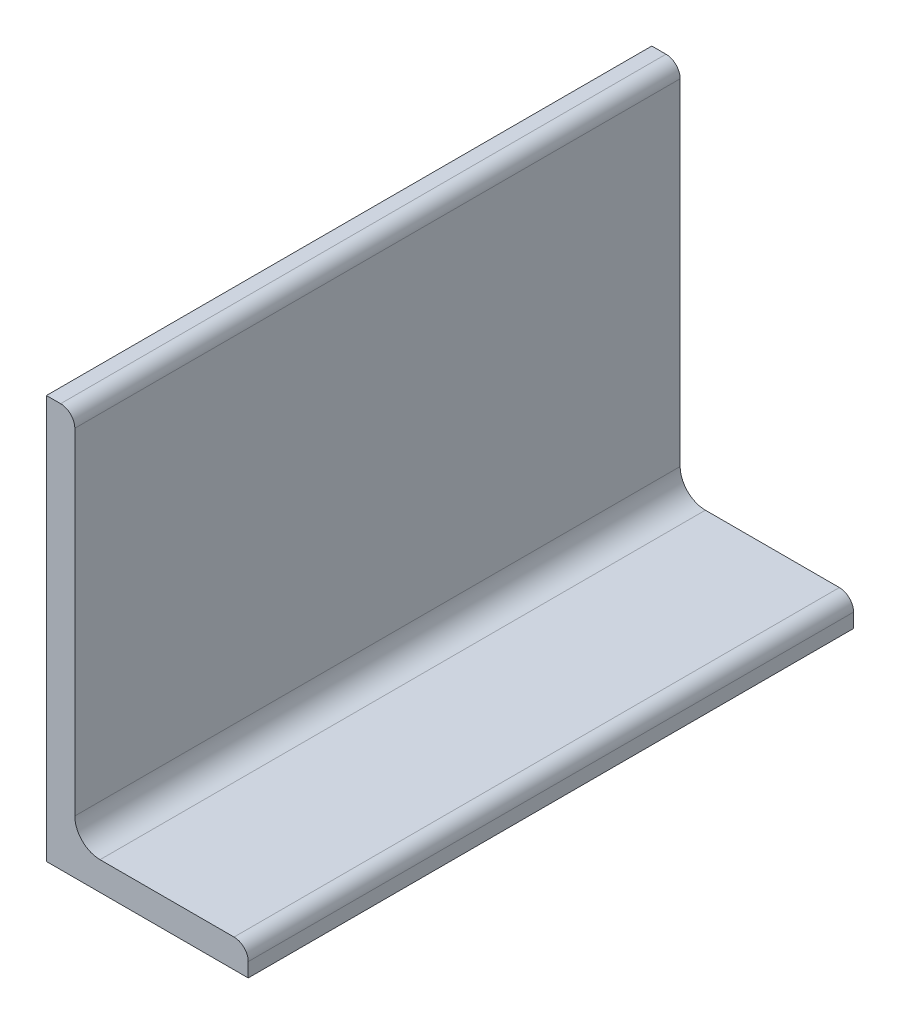
ISO-10303-21;
HEADER;
FILE_DESCRIPTION(('STEP AP214'),'2;1');
FILE_NAME('part.step','',(''),(''),'','','');
FILE_SCHEMA(('AUTOMOTIVE_DESIGN { 1 0 10303 214 1 1 1 1 }'));
ENDSEC;
DATA;
#1=APPLICATION_CONTEXT('core data for automotive mechanical design processes');
#2=APPLICATION_PROTOCOL_DEFINITION('international standard','automotive_design',2000,#1);
#3=PRODUCT_CONTEXT('',#1,'mechanical');
#4=PRODUCT('Part','Part','',(#3));
#5=PRODUCT_RELATED_PRODUCT_CATEGORY('part','',(#4));
#6=PRODUCT_DEFINITION_FORMATION('','',#4);
#7=PRODUCT_DEFINITION_CONTEXT('part definition',#1,'design');
#8=PRODUCT_DEFINITION('design','',#6,#7);
#9=PRODUCT_DEFINITION_SHAPE('','',#8);
#10=(LENGTH_UNIT() NAMED_UNIT(*) SI_UNIT(.MILLI.,.METRE.));
#11=(NAMED_UNIT(*) PLANE_ANGLE_UNIT() SI_UNIT($,.RADIAN.));
#12=(NAMED_UNIT(*) SI_UNIT($,.STERADIAN.) SOLID_ANGLE_UNIT());
#13=UNCERTAINTY_MEASURE_WITH_UNIT(LENGTH_MEASURE(1.E-05),#10,'distance_accuracy_value','');
#14=(GEOMETRIC_REPRESENTATION_CONTEXT(3) GLOBAL_UNCERTAINTY_ASSIGNED_CONTEXT((#13)) GLOBAL_UNIT_ASSIGNED_CONTEXT((#10,
#11,#12)) REPRESENTATION_CONTEXT('',''));
#15=CARTESIAN_POINT('',(0.,0.,0.));
#16=DIRECTION('',(0.,0.,1.));
#17=DIRECTION('',(1.,0.,0.));
#18=AXIS2_PLACEMENT_3D('',#15,#16,#17);
#19=CARTESIAN_POINT('',(0.865045893659089,203.678837479771,304.8));
#20=DIRECTION('',(1.,0.,0.));
#21=DIRECTION('',(0.,0.,-1.));
#22=AXIS2_PLACEMENT_3D('',#19,#20,#21);
#23=PLANE('',#22);
#24=DIRECTION('',(0.,-1.,0.));
#25=VECTOR('',#24,1.);
#26=CARTESIAN_POINT('',(0.865045893659089,203.678837479771,0.));
#27=LINE('',#26,#25);
#28=CARTESIAN_POINT('',(0.865045893659089,203.678837479771,0.));
#29=VERTEX_POINT('',#28);
#30=CARTESIAN_POINT('',(0.865045893659089,0.478837479771347,0.));
#31=VERTEX_POINT('',#30);
#32=EDGE_CURVE('E135',#29,#31,#27,.T.);
#33=ORIENTED_EDGE('',*,*,#32,.T.);
#34=DIRECTION('',(0.,0.,-1.));
#35=VECTOR('',#34,1.);
#36=CARTESIAN_POINT('',(0.865045893659089,0.478837479771347,304.8));
#37=LINE('',#36,#35);
#38=CARTESIAN_POINT('',(0.865045893659089,0.478837479771347,304.8));
#39=VERTEX_POINT('',#38);
#40=EDGE_CURVE('E11',#39,#31,#37,.T.);
#41=ORIENTED_EDGE('',*,*,#40,.F.);
#42=DIRECTION('',(0.,-1.,0.));
#43=VECTOR('',#42,1.);
#44=CARTESIAN_POINT('',(0.865045893659089,203.678837479771,304.8));
#45=LINE('',#44,#43);
#46=CARTESIAN_POINT('',(0.865045893659089,203.678837479771,304.8));
#47=VERTEX_POINT('',#46);
#48=EDGE_CURVE('E151',#47,#39,#45,.T.);
#49=ORIENTED_EDGE('',*,*,#48,.F.);
#50=DIRECTION('',(0.,0.,-1.));
#51=VECTOR('',#50,1.);
#52=CARTESIAN_POINT('',(0.865045893659089,203.678837479771,304.8));
#53=LINE('',#52,#51);
#54=EDGE_CURVE('E131',#47,#29,#53,.T.);
#55=ORIENTED_EDGE('',*,*,#54,.T.);
#56=EDGE_LOOP('',(#33,#41,#49,#55));
#57=FACE_BOUND('',#56,.T.);
#58=ADVANCED_FACE('F33',(#57),#23,.F.);
#59=CARTESIAN_POINT('',(0.865045893659089,0.478837479771347,304.8));
#60=DIRECTION('',(0.,1.,0.));
#61=DIRECTION('',(0.,0.,1.));
#62=AXIS2_PLACEMENT_3D('',#59,#60,#61);
#63=PLANE('',#62);
#64=DIRECTION('',(1.,0.,0.));
#65=VECTOR('',#64,1.);
#66=CARTESIAN_POINT('',(0.865045893659089,0.478837479771347,0.));
#67=LINE('',#66,#65);
#68=CARTESIAN_POINT('',(102.465045893659,0.478837479771347,0.));
#69=VERTEX_POINT('',#68);
#70=EDGE_CURVE('E138',#31,#69,#67,.T.);
#71=ORIENTED_EDGE('',*,*,#70,.T.);
#72=DIRECTION('',(0.,0.,-1.));
#73=VECTOR('',#72,1.);
#74=CARTESIAN_POINT('',(102.465045893659,0.478837479771347,304.8));
#75=LINE('',#74,#73);
#76=CARTESIAN_POINT('',(102.465045893659,0.478837479771347,304.8));
#77=VERTEX_POINT('',#76);
#78=EDGE_CURVE('E41',#77,#69,#75,.T.);
#79=ORIENTED_EDGE('',*,*,#78,.F.);
#80=DIRECTION('',(1.,0.,0.));
#81=VECTOR('',#80,1.);
#82=CARTESIAN_POINT('',(0.865045893659089,0.478837479771347,304.8));
#83=LINE('',#82,#81);
#84=EDGE_CURVE('E95',#39,#77,#83,.T.);
#85=ORIENTED_EDGE('',*,*,#84,.F.);
#86=ORIENTED_EDGE('',*,*,#40,.T.);
#87=EDGE_LOOP('',(#71,#79,#85,#86));
#88=FACE_BOUND('',#87,.T.);
#89=ADVANCED_FACE('F194',(#88),#63,.F.);
#90=CARTESIAN_POINT('',(102.465045893659,0.478837479771347,304.8));
#91=DIRECTION('',(-1.,0.,0.));
#92=DIRECTION('',(0.,0.,1.));
#93=AXIS2_PLACEMENT_3D('',#90,#91,#92);
#94=PLANE('',#93);
#95=DIRECTION('',(0.,1.,0.));
#96=VECTOR('',#95,1.);
#97=CARTESIAN_POINT('',(102.465045893659,0.478837479771347,0.));
#98=LINE('',#97,#96);
#99=CARTESIAN_POINT('',(102.465045893659,7.62258747977135,0.));
#100=VERTEX_POINT('',#99);
#101=EDGE_CURVE('E140',#69,#100,#98,.T.);
#102=ORIENTED_EDGE('',*,*,#101,.T.);
#103=DIRECTION('',(0.,0.,-1.));
#104=VECTOR('',#103,1.);
#105=CARTESIAN_POINT('',(102.465045893659,7.62258747977135,304.8));
#106=LINE('',#105,#104);
#107=CARTESIAN_POINT('',(102.465045893659,7.62258747977135,304.8));
#108=VERTEX_POINT('',#107);
#109=EDGE_CURVE('E161',#108,#100,#106,.T.);
#110=ORIENTED_EDGE('',*,*,#109,.F.);
#111=DIRECTION('',(0.,1.,0.));
#112=VECTOR('',#111,1.);
#113=CARTESIAN_POINT('',(102.465045893659,0.478837479771347,304.8));
#114=LINE('',#113,#112);
#115=EDGE_CURVE('E169',#77,#108,#114,.T.);
#116=ORIENTED_EDGE('',*,*,#115,.F.);
#117=ORIENTED_EDGE('',*,*,#78,.T.);
#118=EDGE_LOOP('',(#102,#110,#116,#117));
#119=FACE_BOUND('',#118,.T.);
#120=ADVANCED_FACE('F167',(#119),#94,.F.);
#121=CARTESIAN_POINT('',(95.3212958936591,7.62258747977135,304.8));
#122=DIRECTION('',(0.,0.,-1.));
#123=DIRECTION('',(-1.,0.,0.));
#124=AXIS2_PLACEMENT_3D('',#121,#122,#123);
#125=CYLINDRICAL_SURFACE('',#124,7.14375000000001);
#126=CARTESIAN_POINT('',(95.3212958936591,7.62258747977135,0.));
#127=DIRECTION('',(0.,0.,1.));
#128=DIRECTION('',(1.,0.,0.));
#129=AXIS2_PLACEMENT_3D('',#126,#127,#128);
#130=CIRCLE('',#129,7.14375000000001);
#131=CARTESIAN_POINT('',(95.3212958936591,14.7663374797714,0.));
#132=VERTEX_POINT('',#131);
#133=EDGE_CURVE('E142',#100,#132,#130,.T.);
#134=ORIENTED_EDGE('',*,*,#133,.T.);
#135=DIRECTION('',(0.,0.,-1.));
#136=VECTOR('',#135,1.);
#137=CARTESIAN_POINT('',(95.3212958936591,14.7663374797714,304.8));
#138=LINE('',#137,#136);
#139=CARTESIAN_POINT('',(95.3212958936591,14.7663374797714,304.8));
#140=VERTEX_POINT('',#139);
#141=EDGE_CURVE('E158',#140,#132,#138,.T.);
#142=ORIENTED_EDGE('',*,*,#141,.F.);
#143=CARTESIAN_POINT('',(95.3212958936591,7.62258747977135,304.8));
#144=DIRECTION('',(0.,0.,1.));
#145=DIRECTION('',(1.,0.,0.));
#146=AXIS2_PLACEMENT_3D('',#143,#144,#145);
#147=CIRCLE('',#146,7.14375000000001);
#148=EDGE_CURVE('E185',#108,#140,#147,.T.);
#149=ORIENTED_EDGE('',*,*,#148,.F.);
#150=ORIENTED_EDGE('',*,*,#109,.T.);
#151=EDGE_LOOP('',(#134,#142,#149,#150));
#152=FACE_BOUND('',#151,.T.);
#153=ADVANCED_FACE('F178',(#152),#125,.T.);
#154=CARTESIAN_POINT('',(95.3212958936591,14.7663374797713,304.8));
#155=DIRECTION('',(0.,-1.,0.));
#156=DIRECTION('',(0.,0.,-1.));
#157=AXIS2_PLACEMENT_3D('',#154,#155,#156);
#158=PLANE('',#157);
#159=DIRECTION('',(-1.,0.,0.));
#160=VECTOR('',#159,1.);
#161=CARTESIAN_POINT('',(95.3212958936591,14.7663374797713,0.));
#162=LINE('',#161,#160);
#163=CARTESIAN_POINT('',(27.8525458936591,14.7663374797713,0.));
#164=VERTEX_POINT('',#163);
#165=EDGE_CURVE('E144',#132,#164,#162,.T.);
#166=ORIENTED_EDGE('',*,*,#165,.T.);
#167=DIRECTION('',(0.,0.,-1.));
#168=VECTOR('',#167,1.);
#169=CARTESIAN_POINT('',(27.8525458936591,14.7663374797713,304.8));
#170=LINE('',#169,#168);
#171=CARTESIAN_POINT('',(27.8525458936591,14.7663374797713,304.8));
#172=VERTEX_POINT('',#171);
#173=EDGE_CURVE('E155',#172,#164,#170,.T.);
#174=ORIENTED_EDGE('',*,*,#173,.F.);
#175=DIRECTION('',(-1.,0.,0.));
#176=VECTOR('',#175,1.);
#177=CARTESIAN_POINT('',(95.3212958936591,14.7663374797713,304.8));
#178=LINE('',#177,#176);
#179=EDGE_CURVE('E184',#140,#172,#178,.T.);
#180=ORIENTED_EDGE('',*,*,#179,.F.);
#181=ORIENTED_EDGE('',*,*,#141,.T.);
#182=EDGE_LOOP('',(#166,#174,#180,#181));
#183=FACE_BOUND('',#182,.T.);
#184=ADVANCED_FACE('F182',(#183),#158,.F.);
#185=CARTESIAN_POINT('',(27.8525458936591,27.4663374797713,304.8));
#186=DIRECTION('',(0.,0.,-1.));
#187=DIRECTION('',(-1.,0.,0.));
#188=AXIS2_PLACEMENT_3D('',#185,#186,#187);
#189=CYLINDRICAL_SURFACE('',#188,12.7);
#190=CARTESIAN_POINT('',(27.8525458936591,27.4663374797713,0.));
#191=DIRECTION('',(0.,0.,-1.));
#192=DIRECTION('',(1.,0.,0.));
#193=AXIS2_PLACEMENT_3D('',#190,#191,#192);
#194=CIRCLE('',#193,12.7);
#195=CARTESIAN_POINT('',(15.1525458936591,27.4663374797713,0.));
#196=VERTEX_POINT('',#195);
#197=EDGE_CURVE('E146',#164,#196,#194,.T.);
#198=ORIENTED_EDGE('',*,*,#197,.T.);
#199=DIRECTION('',(0.,0.,-1.));
#200=VECTOR('',#199,1.);
#201=CARTESIAN_POINT('',(15.1525458936591,27.4663374797713,304.8));
#202=LINE('',#201,#200);
#203=CARTESIAN_POINT('',(15.1525458936591,27.4663374797713,304.8));
#204=VERTEX_POINT('',#203);
#205=EDGE_CURVE('E126',#204,#196,#202,.T.);
#206=ORIENTED_EDGE('',*,*,#205,.F.);
#207=CARTESIAN_POINT('',(27.8525458936591,27.4663374797713,304.8));
#208=DIRECTION('',(0.,0.,-1.));
#209=DIRECTION('',(1.,0.,0.));
#210=AXIS2_PLACEMENT_3D('',#207,#208,#209);
#211=CIRCLE('',#210,12.7);
#212=EDGE_CURVE('E117',#172,#204,#211,.T.);
#213=ORIENTED_EDGE('',*,*,#212,.F.);
#214=ORIENTED_EDGE('',*,*,#173,.T.);
#215=EDGE_LOOP('',(#198,#206,#213,#214));
#216=FACE_BOUND('',#215,.T.);
#217=ADVANCED_FACE('F206',(#216),#189,.F.);
#218=CARTESIAN_POINT('',(15.1525458936591,27.4663374797713,304.8));
#219=DIRECTION('',(-1.,0.,0.));
#220=DIRECTION('',(0.,0.,1.));
#221=AXIS2_PLACEMENT_3D('',#218,#219,#220);
#222=PLANE('',#221);
#223=DIRECTION('',(0.,1.,0.));
#224=VECTOR('',#223,1.);
#225=CARTESIAN_POINT('',(15.1525458936591,27.4663374797713,0.));
#226=LINE('',#225,#224);
#227=CARTESIAN_POINT('',(15.1525458936591,196.535087479771,0.));
#228=VERTEX_POINT('',#227);
#229=EDGE_CURVE('E125',#196,#228,#226,.T.);
#230=ORIENTED_EDGE('',*,*,#229,.T.);
#231=DIRECTION('',(0.,0.,-1.));
#232=VECTOR('',#231,1.);
#233=CARTESIAN_POINT('',(15.1525458936591,196.535087479771,304.8));
#234=LINE('',#233,#232);
#235=CARTESIAN_POINT('',(15.1525458936591,196.535087479771,304.8));
#236=VERTEX_POINT('',#235);
#237=EDGE_CURVE('E122',#236,#228,#234,.T.);
#238=ORIENTED_EDGE('',*,*,#237,.F.);
#239=DIRECTION('',(0.,1.,0.));
#240=VECTOR('',#239,1.);
#241=CARTESIAN_POINT('',(15.1525458936591,27.4663374797713,304.8));
#242=LINE('',#241,#240);
#243=EDGE_CURVE('E111',#204,#236,#242,.T.);
#244=ORIENTED_EDGE('',*,*,#243,.F.);
#245=ORIENTED_EDGE('',*,*,#205,.T.);
#246=EDGE_LOOP('',(#230,#238,#244,#245));
#247=FACE_BOUND('',#246,.T.);
#248=ADVANCED_FACE('F123',(#247),#222,.F.);
#249=CARTESIAN_POINT('',(8.00879589365907,196.535087479771,304.8));
#250=DIRECTION('',(0.,0.,-1.));
#251=DIRECTION('',(-1.,0.,0.));
#252=AXIS2_PLACEMENT_3D('',#249,#250,#251);
#253=CYLINDRICAL_SURFACE('',#252,7.14375000000001);
#254=CARTESIAN_POINT('',(8.00879589365907,196.535087479771,0.));
#255=DIRECTION('',(0.,0.,1.));
#256=DIRECTION('',(1.,0.,0.));
#257=AXIS2_PLACEMENT_3D('',#254,#255,#256);
#258=CIRCLE('',#257,7.14375000000001);
#259=CARTESIAN_POINT('',(8.00879589365909,203.678837479771,0.));
#260=VERTEX_POINT('',#259);
#261=EDGE_CURVE('E81',#228,#260,#258,.T.);
#262=ORIENTED_EDGE('',*,*,#261,.T.);
#263=DIRECTION('',(0.,0.,-1.));
#264=VECTOR('',#263,1.);
#265=CARTESIAN_POINT('',(8.00879589365909,203.678837479771,304.8));
#266=LINE('',#265,#264);
#267=CARTESIAN_POINT('',(8.00879589365909,203.678837479771,304.8));
#268=VERTEX_POINT('',#267);
#269=EDGE_CURVE('E127',#268,#260,#266,.T.);
#270=ORIENTED_EDGE('',*,*,#269,.F.);
#271=CARTESIAN_POINT('',(8.00879589365907,196.535087479771,304.8));
#272=DIRECTION('',(0.,0.,1.));
#273=DIRECTION('',(1.,0.,0.));
#274=AXIS2_PLACEMENT_3D('',#271,#272,#273);
#275=CIRCLE('',#274,7.14375000000001);
#276=EDGE_CURVE('E115',#236,#268,#275,.T.);
#277=ORIENTED_EDGE('',*,*,#276,.F.);
#278=ORIENTED_EDGE('',*,*,#237,.T.);
#279=EDGE_LOOP('',(#262,#270,#277,#278));
#280=FACE_BOUND('',#279,.T.);
#281=ADVANCED_FACE('F129',(#280),#253,.T.);
#282=CARTESIAN_POINT('',(8.00879589365909,203.678837479771,304.8));
#283=DIRECTION('',(0.,-1.,0.));
#284=DIRECTION('',(0.,0.,-1.));
#285=AXIS2_PLACEMENT_3D('',#282,#283,#284);
#286=PLANE('',#285);
#287=DIRECTION('',(-1.,0.,0.));
#288=VECTOR('',#287,1.);
#289=CARTESIAN_POINT('',(8.00879589365909,203.678837479771,0.));
#290=LINE('',#289,#288);
#291=EDGE_CURVE('E87',#260,#29,#290,.T.);
#292=ORIENTED_EDGE('',*,*,#291,.T.);
#293=ORIENTED_EDGE('',*,*,#54,.F.);
#294=DIRECTION('',(-1.,0.,0.));
#295=VECTOR('',#294,1.);
#296=CARTESIAN_POINT('',(8.00879589365909,203.678837479771,304.8));
#297=LINE('',#296,#295);
#298=EDGE_CURVE('E49',#268,#47,#297,.T.);
#299=ORIENTED_EDGE('',*,*,#298,.F.);
#300=ORIENTED_EDGE('',*,*,#269,.T.);
#301=EDGE_LOOP('',(#292,#293,#299,#300));
#302=FACE_BOUND('',#301,.T.);
#303=ADVANCED_FACE('F214',(#302),#286,.F.);
#304=CARTESIAN_POINT('',(95.3212958936591,7.62258747977135,304.8));
#305=DIRECTION('',(0.,0.,1.));
#306=DIRECTION('',(1.,0.,0.));
#307=AXIS2_PLACEMENT_3D('',#304,#305,#306);
#308=PLANE('',#307);
#309=ORIENTED_EDGE('',*,*,#48,.T.);
#310=ORIENTED_EDGE('',*,*,#84,.T.);
#311=ORIENTED_EDGE('',*,*,#115,.T.);
#312=ORIENTED_EDGE('',*,*,#148,.T.);
#313=ORIENTED_EDGE('',*,*,#179,.T.);
#314=ORIENTED_EDGE('',*,*,#212,.T.);
#315=ORIENTED_EDGE('',*,*,#243,.T.);
#316=ORIENTED_EDGE('',*,*,#276,.T.);
#317=ORIENTED_EDGE('',*,*,#298,.T.);
#318=EDGE_LOOP('',(#309,#310,#311,#312,#313,#314,#315,#316,#317));
#319=FACE_BOUND('',#318,.T.);
#320=ADVANCED_FACE('F113',(#319),#308,.T.);
#321=CARTESIAN_POINT('',(95.3212958936591,7.62258747977135,0.));
#322=DIRECTION('',(0.,0.,1.));
#323=DIRECTION('',(1.,0.,0.));
#324=AXIS2_PLACEMENT_3D('',#321,#322,#323);
#325=PLANE('',#324);
#326=ORIENTED_EDGE('',*,*,#32,.F.);
#327=ORIENTED_EDGE('',*,*,#291,.F.);
#328=ORIENTED_EDGE('',*,*,#261,.F.);
#329=ORIENTED_EDGE('',*,*,#229,.F.);
#330=ORIENTED_EDGE('',*,*,#197,.F.);
#331=ORIENTED_EDGE('',*,*,#165,.F.);
#332=ORIENTED_EDGE('',*,*,#133,.F.);
#333=ORIENTED_EDGE('',*,*,#101,.F.);
#334=ORIENTED_EDGE('',*,*,#70,.F.);
#335=EDGE_LOOP('',(#326,#327,#328,#329,#330,#331,#332,#333,#334));
#336=FACE_BOUND('',#335,.T.);
#337=ADVANCED_FACE('F173',(#336),#325,.F.);
#338=CLOSED_SHELL('',(#58,#89,#120,#153,#184,#217,#248,#281,#303,#320,#337));
#339=MANIFOLD_SOLID_BREP('B2',#338);
#340=ADVANCED_BREP_SHAPE_REPRESENTATION('',(#18,#339),#14);
#341=SHAPE_DEFINITION_REPRESENTATION(#9,#340);
ENDSEC;
END-ISO-10303-21;
